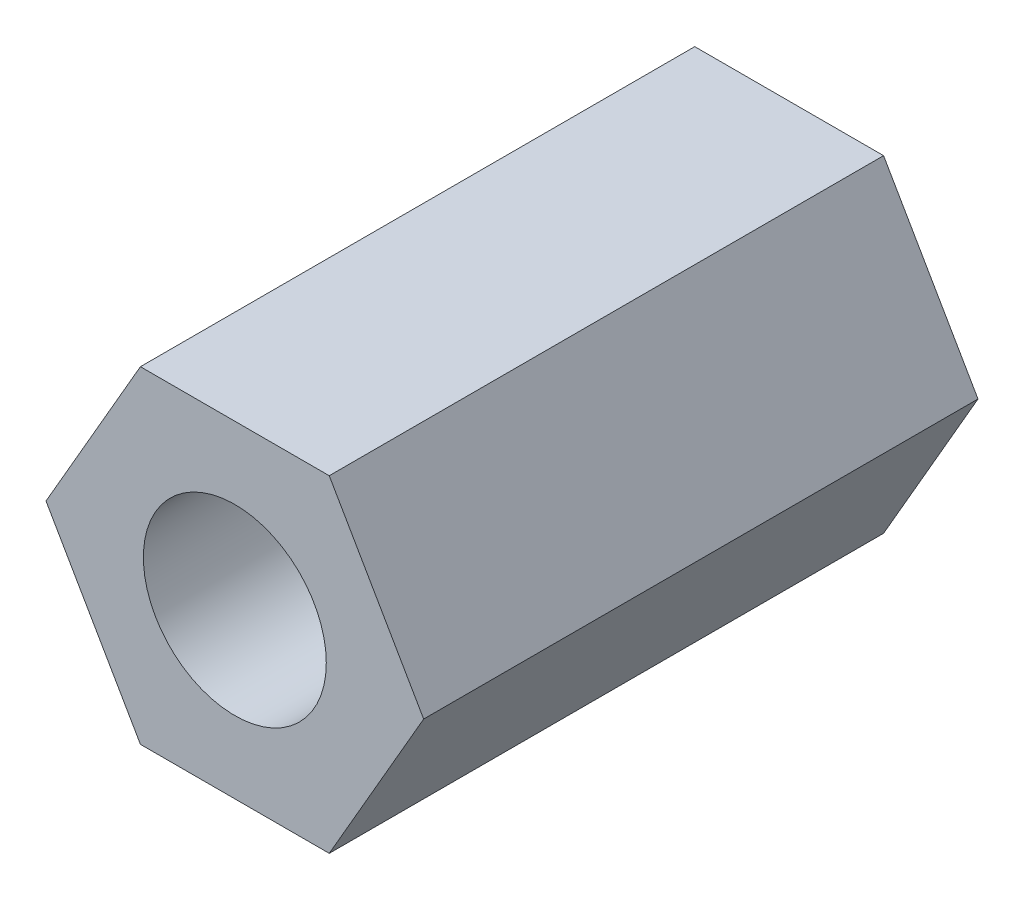
ISO-10303-21;
HEADER;
FILE_DESCRIPTION(('STEP AP214'),'2;1');
FILE_NAME('part.step','',(''),(''),'','','');
FILE_SCHEMA(('AUTOMOTIVE_DESIGN { 1 0 10303 214 1 1 1 1 }'));
ENDSEC;
DATA;
#1=APPLICATION_CONTEXT('core data for automotive mechanical design processes');
#2=APPLICATION_PROTOCOL_DEFINITION('international standard','automotive_design',2000,#1);
#3=PRODUCT_CONTEXT('',#1,'mechanical');
#4=PRODUCT('Part','Part','',(#3));
#5=PRODUCT_RELATED_PRODUCT_CATEGORY('part','',(#4));
#6=PRODUCT_DEFINITION_FORMATION('','',#4);
#7=PRODUCT_DEFINITION_CONTEXT('part definition',#1,'design');
#8=PRODUCT_DEFINITION('design','',#6,#7);
#9=PRODUCT_DEFINITION_SHAPE('','',#8);
#10=(LENGTH_UNIT() NAMED_UNIT(*) SI_UNIT(.MILLI.,.METRE.));
#11=(NAMED_UNIT(*) PLANE_ANGLE_UNIT() SI_UNIT($,.RADIAN.));
#12=(NAMED_UNIT(*) SI_UNIT($,.STERADIAN.) SOLID_ANGLE_UNIT());
#13=UNCERTAINTY_MEASURE_WITH_UNIT(LENGTH_MEASURE(1.E-05),#10,'distance_accuracy_value','');
#14=(GEOMETRIC_REPRESENTATION_CONTEXT(3) GLOBAL_UNCERTAINTY_ASSIGNED_CONTEXT((#13)) GLOBAL_UNIT_ASSIGNED_CONTEXT((#10,
#11,#12)) REPRESENTATION_CONTEXT('',''));
#15=CARTESIAN_POINT('',(0.,0.,0.));
#16=DIRECTION('',(0.,0.,1.));
#17=DIRECTION('',(1.,0.,0.));
#18=AXIS2_PLACEMENT_3D('',#15,#16,#17);
#19=CARTESIAN_POINT('',(3.40636658821879,0.,10.));
#20=DIRECTION('',(-0.866025403784439,-0.5,0.));
#21=DIRECTION('',(0.5,-0.866025403784439,0.));
#22=AXIS2_PLACEMENT_3D('',#19,#20,#21);
#23=PLANE('',#22);
#24=DIRECTION('',(-0.5,0.866025403784438,0.));
#25=VECTOR('',#24,1.);
#26=CARTESIAN_POINT('',(3.40636658821879,0.,0.));
#27=LINE('',#26,#25);
#28=CARTESIAN_POINT('',(3.40636658821879,0.,0.));
#29=VERTEX_POINT('',#28);
#30=CARTESIAN_POINT('',(1.7031832941094,2.95,0.));
#31=VERTEX_POINT('',#30);
#32=EDGE_CURVE('E130',#29,#31,#27,.T.);
#33=ORIENTED_EDGE('',*,*,#32,.T.);
#34=DIRECTION('',(0.,0.,-1.));
#35=VECTOR('',#34,1.);
#36=CARTESIAN_POINT('',(1.7031832941094,2.95,10.));
#37=LINE('',#36,#35);
#38=CARTESIAN_POINT('',(1.7031832941094,2.95,10.));
#39=VERTEX_POINT('',#38);
#40=EDGE_CURVE('E11',#39,#31,#37,.T.);
#41=ORIENTED_EDGE('',*,*,#40,.F.);
#42=DIRECTION('',(-0.5,0.866025403784438,0.));
#43=VECTOR('',#42,1.);
#44=CARTESIAN_POINT('',(3.40636658821879,0.,10.));
#45=LINE('',#44,#43);
#46=CARTESIAN_POINT('',(3.40636658821879,0.,10.));
#47=VERTEX_POINT('',#46);
#48=EDGE_CURVE('E147',#47,#39,#45,.T.);
#49=ORIENTED_EDGE('',*,*,#48,.F.);
#50=DIRECTION('',(0.,0.,-1.));
#51=VECTOR('',#50,1.);
#52=CARTESIAN_POINT('',(3.40636658821879,0.,10.));
#53=LINE('',#52,#51);
#54=EDGE_CURVE('E126',#47,#29,#53,.T.);
#55=ORIENTED_EDGE('',*,*,#54,.T.);
#56=EDGE_LOOP('',(#33,#41,#49,#55));
#57=FACE_BOUND('',#56,.T.);
#58=ADVANCED_FACE('F41',(#57),#23,.F.);
#59=CARTESIAN_POINT('',(1.7031832941094,2.95,10.));
#60=DIRECTION('',(0.,-1.,0.));
#61=DIRECTION('',(0.,0.,-1.));
#62=AXIS2_PLACEMENT_3D('',#59,#60,#61);
#63=PLANE('',#62);
#64=DIRECTION('',(-1.,0.,0.));
#65=VECTOR('',#64,1.);
#66=CARTESIAN_POINT('',(1.7031832941094,2.95,0.));
#67=LINE('',#66,#65);
#68=CARTESIAN_POINT('',(-1.7031832941094,2.95,0.));
#69=VERTEX_POINT('',#68);
#70=EDGE_CURVE('E134',#31,#69,#67,.T.);
#71=ORIENTED_EDGE('',*,*,#70,.T.);
#72=DIRECTION('',(0.,0.,-1.));
#73=VECTOR('',#72,1.);
#74=CARTESIAN_POINT('',(-1.7031832941094,2.95,10.));
#75=LINE('',#74,#73);
#76=CARTESIAN_POINT('',(-1.7031832941094,2.95,10.));
#77=VERTEX_POINT('',#76);
#78=EDGE_CURVE('E50',#77,#69,#75,.T.);
#79=ORIENTED_EDGE('',*,*,#78,.F.);
#80=DIRECTION('',(-1.,0.,0.));
#81=VECTOR('',#80,1.);
#82=CARTESIAN_POINT('',(1.7031832941094,2.95,10.));
#83=LINE('',#82,#81);
#84=EDGE_CURVE('E95',#39,#77,#83,.T.);
#85=ORIENTED_EDGE('',*,*,#84,.F.);
#86=ORIENTED_EDGE('',*,*,#40,.T.);
#87=EDGE_LOOP('',(#71,#79,#85,#86));
#88=FACE_BOUND('',#87,.T.);
#89=ADVANCED_FACE('F176',(#88),#63,.F.);
#90=CARTESIAN_POINT('',(-1.7031832941094,2.95,10.));
#91=DIRECTION('',(0.866025403784439,-0.5,0.));
#92=DIRECTION('',(0.5,0.866025403784439,0.));
#93=AXIS2_PLACEMENT_3D('',#90,#91,#92);
#94=PLANE('',#93);
#95=DIRECTION('',(-0.5,-0.866025403784439,0.));
#96=VECTOR('',#95,1.);
#97=CARTESIAN_POINT('',(-1.7031832941094,2.95,0.));
#98=LINE('',#97,#96);
#99=CARTESIAN_POINT('',(-3.40636658821879,0.,0.));
#100=VERTEX_POINT('',#99);
#101=EDGE_CURVE('E138',#69,#100,#98,.T.);
#102=ORIENTED_EDGE('',*,*,#101,.T.);
#103=DIRECTION('',(0.,0.,-1.));
#104=VECTOR('',#103,1.);
#105=CARTESIAN_POINT('',(-3.40636658821879,0.,10.));
#106=LINE('',#105,#104);
#107=CARTESIAN_POINT('',(-3.40636658821879,0.,10.));
#108=VERTEX_POINT('',#107);
#109=EDGE_CURVE('E119',#108,#100,#106,.T.);
#110=ORIENTED_EDGE('',*,*,#109,.F.);
#111=DIRECTION('',(-0.5,-0.866025403784439,0.));
#112=VECTOR('',#111,1.);
#113=CARTESIAN_POINT('',(-1.7031832941094,2.95,10.));
#114=LINE('',#113,#112);
#115=EDGE_CURVE('E108',#77,#108,#114,.T.);
#116=ORIENTED_EDGE('',*,*,#115,.F.);
#117=ORIENTED_EDGE('',*,*,#78,.T.);
#118=EDGE_LOOP('',(#102,#110,#116,#117));
#119=FACE_BOUND('',#118,.T.);
#120=ADVANCED_FACE('F157',(#119),#94,.F.);
#121=CARTESIAN_POINT('',(-3.40636658821879,0.,10.));
#122=DIRECTION('',(0.866025403784439,0.5,0.));
#123=DIRECTION('',(-0.5,0.866025403784439,0.));
#124=AXIS2_PLACEMENT_3D('',#121,#122,#123);
#125=PLANE('',#124);
#126=DIRECTION('',(0.5,-0.866025403784438,0.));
#127=VECTOR('',#126,1.);
#128=CARTESIAN_POINT('',(-3.40636658821879,0.,0.));
#129=LINE('',#128,#127);
#130=CARTESIAN_POINT('',(-1.70318329410939,-2.95,0.));
#131=VERTEX_POINT('',#130);
#132=EDGE_CURVE('E117',#100,#131,#129,.T.);
#133=ORIENTED_EDGE('',*,*,#132,.T.);
#134=DIRECTION('',(0.,0.,-1.));
#135=VECTOR('',#134,1.);
#136=CARTESIAN_POINT('',(-1.70318329410939,-2.95,10.));
#137=LINE('',#136,#135);
#138=CARTESIAN_POINT('',(-1.70318329410939,-2.95,10.));
#139=VERTEX_POINT('',#138);
#140=EDGE_CURVE('E114',#139,#131,#137,.T.);
#141=ORIENTED_EDGE('',*,*,#140,.F.);
#142=DIRECTION('',(0.5,-0.866025403784438,0.));
#143=VECTOR('',#142,1.);
#144=CARTESIAN_POINT('',(-3.40636658821879,0.,10.));
#145=LINE('',#144,#143);
#146=EDGE_CURVE('E102',#108,#139,#145,.T.);
#147=ORIENTED_EDGE('',*,*,#146,.F.);
#148=ORIENTED_EDGE('',*,*,#109,.T.);
#149=EDGE_LOOP('',(#133,#141,#147,#148));
#150=FACE_BOUND('',#149,.T.);
#151=ADVANCED_FACE('F115',(#150),#125,.F.);
#152=CARTESIAN_POINT('',(-1.70318329410939,-2.95,10.));
#153=DIRECTION('',(0.,1.,0.));
#154=DIRECTION('',(-1.,0.,0.));
#155=AXIS2_PLACEMENT_3D('',#152,#153,#154);
#156=PLANE('',#155);
#157=DIRECTION('',(1.,0.,0.));
#158=VECTOR('',#157,1.);
#159=CARTESIAN_POINT('',(-1.70318329410939,-2.95,0.));
#160=LINE('',#159,#158);
#161=CARTESIAN_POINT('',(1.7031832941094,-2.95,0.));
#162=VERTEX_POINT('',#161);
#163=EDGE_CURVE('E81',#131,#162,#160,.T.);
#164=ORIENTED_EDGE('',*,*,#163,.T.);
#165=DIRECTION('',(0.,0.,-1.));
#166=VECTOR('',#165,1.);
#167=CARTESIAN_POINT('',(1.7031832941094,-2.95,10.));
#168=LINE('',#167,#166);
#169=CARTESIAN_POINT('',(1.7031832941094,-2.95,10.));
#170=VERTEX_POINT('',#169);
#171=EDGE_CURVE('E120',#170,#162,#168,.T.);
#172=ORIENTED_EDGE('',*,*,#171,.F.);
#173=DIRECTION('',(1.,0.,0.));
#174=VECTOR('',#173,1.);
#175=CARTESIAN_POINT('',(-1.70318329410939,-2.95,10.));
#176=LINE('',#175,#174);
#177=EDGE_CURVE('E106',#139,#170,#176,.T.);
#178=ORIENTED_EDGE('',*,*,#177,.F.);
#179=ORIENTED_EDGE('',*,*,#140,.T.);
#180=EDGE_LOOP('',(#164,#172,#178,#179));
#181=FACE_BOUND('',#180,.T.);
#182=ADVANCED_FACE('F122',(#181),#156,.F.);
#183=CARTESIAN_POINT('',(1.7031832941094,-2.95,10.));
#184=DIRECTION('',(-0.866025403784439,0.5,0.));
#185=DIRECTION('',(-0.5,-0.866025403784439,0.));
#186=AXIS2_PLACEMENT_3D('',#183,#184,#185);
#187=PLANE('',#186);
#188=DIRECTION('',(0.5,0.866025403784439,0.));
#189=VECTOR('',#188,1.);
#190=CARTESIAN_POINT('',(1.7031832941094,-2.95,0.));
#191=LINE('',#190,#189);
#192=EDGE_CURVE('E87',#162,#29,#191,.T.);
#193=ORIENTED_EDGE('',*,*,#192,.T.);
#194=ORIENTED_EDGE('',*,*,#54,.F.);
#195=DIRECTION('',(0.5,0.866025403784439,0.));
#196=VECTOR('',#195,1.);
#197=CARTESIAN_POINT('',(1.7031832941094,-2.95,10.));
#198=LINE('',#197,#196);
#199=EDGE_CURVE('E58',#170,#47,#198,.T.);
#200=ORIENTED_EDGE('',*,*,#199,.F.);
#201=ORIENTED_EDGE('',*,*,#171,.T.);
#202=EDGE_LOOP('',(#193,#194,#200,#201));
#203=FACE_BOUND('',#202,.T.);
#204=ADVANCED_FACE('F164',(#203),#187,.F.);
#205=CARTESIAN_POINT('',(0.,0.,10.));
#206=DIRECTION('',(0.,0.,1.));
#207=DIRECTION('',(1.,0.,0.));
#208=AXIS2_PLACEMENT_3D('',#205,#206,#207);
#209=PLANE('',#208);
#210=CARTESIAN_POINT('',(0.,0.,10.));
#211=DIRECTION('',(0.,0.,1.));
#212=DIRECTION('',(1.,0.,0.));
#213=AXIS2_PLACEMENT_3D('',#210,#211,#212);
#214=CIRCLE('',#213,1.65);
#215=CARTESIAN_POINT('',(1.65,0.,10.));
#216=VERTEX_POINT('',#215);
#217=EDGE_CURVE('E233',#216,#216,#214,.T.);
#218=ORIENTED_EDGE('',*,*,#217,.F.);
#219=EDGE_LOOP('',(#218));
#220=FACE_BOUND('',#219,.T.);
#221=ORIENTED_EDGE('',*,*,#48,.T.);
#222=ORIENTED_EDGE('',*,*,#84,.T.);
#223=ORIENTED_EDGE('',*,*,#115,.T.);
#224=ORIENTED_EDGE('',*,*,#146,.T.);
#225=ORIENTED_EDGE('',*,*,#177,.T.);
#226=ORIENTED_EDGE('',*,*,#199,.T.);
#227=EDGE_LOOP('',(#221,#222,#223,#224,#225,#226));
#228=FACE_BOUND('',#227,.T.);
#229=ADVANCED_FACE('F104',(#220,#228),#209,.T.);
#230=CARTESIAN_POINT('',(0.,0.,0.));
#231=DIRECTION('',(0.,0.,1.));
#232=DIRECTION('',(1.,0.,0.));
#233=AXIS2_PLACEMENT_3D('',#230,#231,#232);
#234=PLANE('',#233);
#235=CARTESIAN_POINT('',(0.,0.,0.));
#236=DIRECTION('',(0.,0.,1.));
#237=DIRECTION('',(1.,0.,0.));
#238=AXIS2_PLACEMENT_3D('',#235,#236,#237);
#239=CIRCLE('',#238,1.65);
#240=CARTESIAN_POINT('',(1.65,0.,0.));
#241=VERTEX_POINT('',#240);
#242=EDGE_CURVE('E135',#241,#241,#239,.T.);
#243=ORIENTED_EDGE('',*,*,#242,.T.);
#244=EDGE_LOOP('',(#243));
#245=FACE_BOUND('',#244,.T.);
#246=ORIENTED_EDGE('',*,*,#32,.F.);
#247=ORIENTED_EDGE('',*,*,#192,.F.);
#248=ORIENTED_EDGE('',*,*,#163,.F.);
#249=ORIENTED_EDGE('',*,*,#132,.F.);
#250=ORIENTED_EDGE('',*,*,#101,.F.);
#251=ORIENTED_EDGE('',*,*,#70,.F.);
#252=EDGE_LOOP('',(#246,#247,#248,#249,#250,#251));
#253=FACE_BOUND('',#252,.T.);
#254=ADVANCED_FACE('F160',(#245,#253),#234,.F.);
#255=CARTESIAN_POINT('',(0.,0.,10.));
#256=DIRECTION('',(0.,0.,1.));
#257=DIRECTION('',(1.,0.,0.));
#258=AXIS2_PLACEMENT_3D('',#255,#256,#257);
#259=CYLINDRICAL_SURFACE('',#258,1.65);
#260=ORIENTED_EDGE('',*,*,#242,.F.);
#261=EDGE_LOOP('',(#260));
#262=FACE_BOUND('',#261,.T.);
#263=ORIENTED_EDGE('',*,*,#217,.T.);
#264=EDGE_LOOP('',(#263));
#265=FACE_BOUND('',#264,.T.);
#266=ADVANCED_FACE('F213',(#262,#265),#259,.F.);
#267=CLOSED_SHELL('',(#58,#89,#120,#151,#182,#204,#229,#254,#266));
#268=MANIFOLD_SOLID_BREP('B2',#267);
#269=ADVANCED_BREP_SHAPE_REPRESENTATION('',(#18,#268),#14);
#270=SHAPE_DEFINITION_REPRESENTATION(#9,#269);
ENDSEC;
END-ISO-10303-21;
